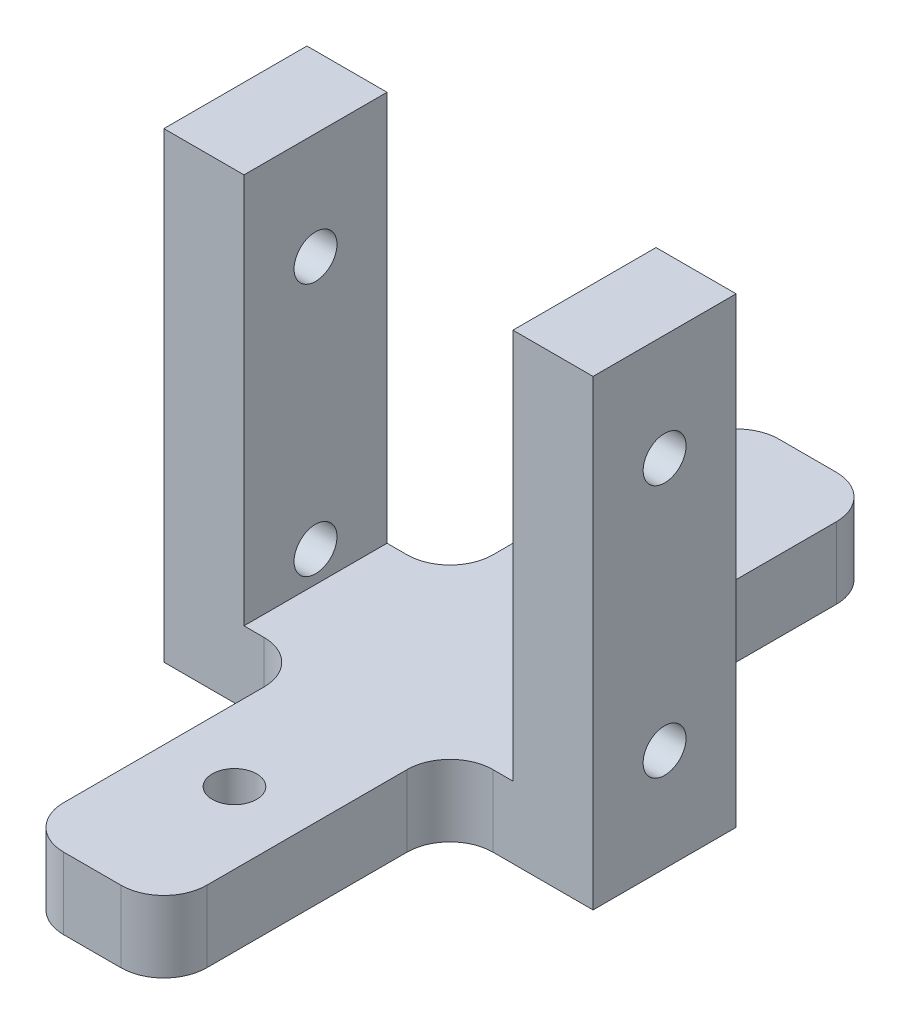
ISO-10303-21;
HEADER;
FILE_DESCRIPTION(('STEP AP214'),'2;1');
FILE_NAME('part.step','',(''),(''),'','','');
FILE_SCHEMA(('AUTOMOTIVE_DESIGN { 1 0 10303 214 1 1 1 1 }'));
ENDSEC;
DATA;
#1=APPLICATION_CONTEXT('core data for automotive mechanical design processes');
#2=APPLICATION_PROTOCOL_DEFINITION('international standard','automotive_design',2000,#1);
#3=PRODUCT_CONTEXT('',#1,'mechanical');
#4=PRODUCT('Part','Part','',(#3));
#5=PRODUCT_RELATED_PRODUCT_CATEGORY('part','',(#4));
#6=PRODUCT_DEFINITION_FORMATION('','',#4);
#7=PRODUCT_DEFINITION_CONTEXT('part definition',#1,'design');
#8=PRODUCT_DEFINITION('design','',#6,#7);
#9=PRODUCT_DEFINITION_SHAPE('','',#8);
#10=(LENGTH_UNIT() NAMED_UNIT(*) SI_UNIT(.MILLI.,.METRE.));
#11=(NAMED_UNIT(*) PLANE_ANGLE_UNIT() SI_UNIT($,.RADIAN.));
#12=(NAMED_UNIT(*) SI_UNIT($,.STERADIAN.) SOLID_ANGLE_UNIT());
#13=UNCERTAINTY_MEASURE_WITH_UNIT(LENGTH_MEASURE(1.E-05),#10,'distance_accuracy_value','');
#14=(GEOMETRIC_REPRESENTATION_CONTEXT(3) GLOBAL_UNCERTAINTY_ASSIGNED_CONTEXT((#13)) GLOBAL_UNIT_ASSIGNED_CONTEXT((#10,
#11,#12)) REPRESENTATION_CONTEXT('',''));
#15=CARTESIAN_POINT('',(0.,0.,0.));
#16=DIRECTION('',(0.,0.,1.));
#17=DIRECTION('',(1.,0.,0.));
#18=AXIS2_PLACEMENT_3D('',#15,#16,#17);
#19=CARTESIAN_POINT('',(-31.4324632794616,5.,-14.8201463090871));
#20=DIRECTION('',(0.,0.,-1.));
#21=DIRECTION('',(-1.,0.,0.));
#22=AXIS2_PLACEMENT_3D('',#19,#20,#21);
#23=PLANE('',#22);
#24=DIRECTION('',(1.,0.,0.));
#25=VECTOR('',#24,1.);
#26=CARTESIAN_POINT('',(-31.4324632794616,5.,-14.8201463090871));
#27=LINE('',#26,#25);
#28=CARTESIAN_POINT('',(-8.43246327946162,5.,-14.8201463090871));
#29=VERTEX_POINT('',#28);
#30=CARTESIAN_POINT('',(-7.03246327946162,5.,-14.8201463090871));
#31=VERTEX_POINT('',#30);
#32=EDGE_CURVE('E384',#29,#31,#27,.T.);
#33=ORIENTED_EDGE('',*,*,#32,.F.);
#34=DIRECTION('',(0.,1.,0.));
#35=VECTOR('',#34,1.);
#36=CARTESIAN_POINT('',(-8.43246327946162,0.,-14.8201463090871));
#37=LINE('',#36,#35);
#38=CARTESIAN_POINT('',(-8.43246327946162,0.,-14.8201463090871));
#39=VERTEX_POINT('',#38);
#40=EDGE_CURVE('E340',#29,#39,#37,.F.);
#41=ORIENTED_EDGE('',*,*,#40,.T.);
#42=DIRECTION('',(1.,0.,0.));
#43=VECTOR('',#42,1.);
#44=CARTESIAN_POINT('',(-31.4324632794616,0.,-14.8201463090871));
#45=LINE('',#44,#43);
#46=CARTESIAN_POINT('',(-1.43246327946162,0.,-14.8201463090871));
#47=VERTEX_POINT('',#46);
#48=EDGE_CURVE('E316',#39,#47,#45,.T.);
#49=ORIENTED_EDGE('',*,*,#48,.T.);
#50=DIRECTION('',(0.,-1.,0.));
#51=VECTOR('',#50,1.);
#52=CARTESIAN_POINT('',(-1.43246327946162,5.,-14.8201463090871));
#53=LINE('',#52,#51);
#54=CARTESIAN_POINT('',(-1.43246327946162,32.3,-14.8201463090871));
#55=VERTEX_POINT('',#54);
#56=EDGE_CURVE('E203',#55,#47,#53,.T.);
#57=ORIENTED_EDGE('',*,*,#56,.F.);
#58=DIRECTION('',(1.,0.,0.));
#59=VECTOR('',#58,1.);
#60=CARTESIAN_POINT('',(-1.43246327946162,32.3,-14.8201463090871));
#61=LINE('',#60,#59);
#62=CARTESIAN_POINT('',(-7.03246327946162,32.3,-14.8201463090871));
#63=VERTEX_POINT('',#62);
#64=EDGE_CURVE('E219',#63,#55,#61,.T.);
#65=ORIENTED_EDGE('',*,*,#64,.F.);
#66=DIRECTION('',(0.,-1.,0.));
#67=VECTOR('',#66,1.);
#68=CARTESIAN_POINT('',(-7.03246327946162,32.3,-14.8201463090871));
#69=LINE('',#68,#67);
#70=EDGE_CURVE('E229',#63,#31,#69,.T.);
#71=ORIENTED_EDGE('',*,*,#70,.T.);
#72=EDGE_LOOP('',(#33,#41,#49,#57,#65,#71));
#73=FACE_BOUND('',#72,.T.);
#74=ADVANCED_FACE('F33',(#73),#23,.F.);
#75=CARTESIAN_POINT('',(-31.4324632794616,0.,-14.8201463090871));
#76=VERTEX_POINT('',#75);
#77=CARTESIAN_POINT('',(-24.4324632794616,0.,-14.8201463090871));
#78=VERTEX_POINT('',#77);
#79=EDGE_CURVE('E402',#76,#78,#45,.T.);
#80=ORIENTED_EDGE('',*,*,#79,.T.);
#81=DIRECTION('',(0.,-1.,0.));
#82=VECTOR('',#81,1.);
#83=CARTESIAN_POINT('',(-24.4324632794616,5.,-14.8201463090871));
#84=LINE('',#83,#82);
#85=CARTESIAN_POINT('',(-24.4324632794616,5.,-14.8201463090871));
#86=VERTEX_POINT('',#85);
#87=EDGE_CURVE('E346',#78,#86,#84,.F.);
#88=ORIENTED_EDGE('',*,*,#87,.T.);
#89=CARTESIAN_POINT('',(-25.8324632794616,5.,-14.8201463090871));
#90=VERTEX_POINT('',#89);
#91=EDGE_CURVE('E254',#90,#86,#27,.T.);
#92=ORIENTED_EDGE('',*,*,#91,.F.);
#93=DIRECTION('',(0.,-1.,0.));
#94=VECTOR('',#93,1.);
#95=CARTESIAN_POINT('',(-25.8324632794616,32.3,-14.8201463090871));
#96=LINE('',#95,#94);
#97=CARTESIAN_POINT('',(-25.8324632794616,32.3,-14.8201463090871));
#98=VERTEX_POINT('',#97);
#99=EDGE_CURVE('E258',#98,#90,#96,.T.);
#100=ORIENTED_EDGE('',*,*,#99,.F.);
#101=DIRECTION('',(1.,0.,0.));
#102=VECTOR('',#101,1.);
#103=CARTESIAN_POINT('',(-31.4324632794616,32.3,-14.8201463090871));
#104=LINE('',#103,#102);
#105=CARTESIAN_POINT('',(-31.4324632794616,32.3,-14.8201463090871));
#106=VERTEX_POINT('',#105);
#107=EDGE_CURVE('E238',#106,#98,#104,.T.);
#108=ORIENTED_EDGE('',*,*,#107,.F.);
#109=DIRECTION('',(0.,-1.,0.));
#110=VECTOR('',#109,1.);
#111=CARTESIAN_POINT('',(-31.4324632794616,5.,-14.8201463090871));
#112=LINE('',#111,#110);
#113=EDGE_CURVE('E422',#106,#76,#112,.T.);
#114=ORIENTED_EDGE('',*,*,#113,.T.);
#115=EDGE_LOOP('',(#80,#88,#92,#100,#108,#114));
#116=FACE_BOUND('',#115,.T.);
#117=ADVANCED_FACE('F485',(#116),#23,.F.);
#118=CARTESIAN_POINT('',(-31.4324632794616,5.,-24.8201463090871));
#119=DIRECTION('',(0.,0.,1.));
#120=DIRECTION('',(1.,0.,0.));
#121=AXIS2_PLACEMENT_3D('',#118,#119,#120);
#122=PLANE('',#121);
#123=DIRECTION('',(-1.,0.,0.));
#124=VECTOR('',#123,1.);
#125=CARTESIAN_POINT('',(-31.4324632794616,0.,-24.8201463090871));
#126=LINE('',#125,#124);
#127=CARTESIAN_POINT('',(-1.43246327946162,0.,-24.8201463090871));
#128=VERTEX_POINT('',#127);
#129=CARTESIAN_POINT('',(-8.43246327946162,0.,-24.8201463090871));
#130=VERTEX_POINT('',#129);
#131=EDGE_CURVE('E387',#128,#130,#126,.T.);
#132=ORIENTED_EDGE('',*,*,#131,.T.);
#133=DIRECTION('',(0.,-1.,0.));
#134=VECTOR('',#133,1.);
#135=CARTESIAN_POINT('',(-8.43246327946162,5.,-24.8201463090871));
#136=LINE('',#135,#134);
#137=CARTESIAN_POINT('',(-8.43246327946162,5.,-24.8201463090871));
#138=VERTEX_POINT('',#137);
#139=EDGE_CURVE('E333',#130,#138,#136,.F.);
#140=ORIENTED_EDGE('',*,*,#139,.T.);
#141=DIRECTION('',(-1.,0.,0.));
#142=VECTOR('',#141,1.);
#143=CARTESIAN_POINT('',(-31.4324632794616,5.,-24.8201463090871));
#144=LINE('',#143,#142);
#145=CARTESIAN_POINT('',(-7.03246327946162,5.,-24.8201463090871));
#146=VERTEX_POINT('',#145);
#147=EDGE_CURVE('E266',#146,#138,#144,.T.);
#148=ORIENTED_EDGE('',*,*,#147,.F.);
#149=DIRECTION('',(0.,-1.,0.));
#150=VECTOR('',#149,1.);
#151=CARTESIAN_POINT('',(-7.03246327946162,32.3,-24.8201463090871));
#152=LINE('',#151,#150);
#153=CARTESIAN_POINT('',(-7.03246327946162,32.3,-24.8201463090871));
#154=VERTEX_POINT('',#153);
#155=EDGE_CURVE('E211',#154,#146,#152,.T.);
#156=ORIENTED_EDGE('',*,*,#155,.F.);
#157=DIRECTION('',(-1.,0.,0.));
#158=VECTOR('',#157,1.);
#159=CARTESIAN_POINT('',(-1.43246327946162,32.3,-24.8201463090871));
#160=LINE('',#159,#158);
#161=CARTESIAN_POINT('',(-1.43246327946162,32.3,-24.8201463090871));
#162=VERTEX_POINT('',#161);
#163=EDGE_CURVE('E207',#162,#154,#160,.T.);
#164=ORIENTED_EDGE('',*,*,#163,.F.);
#165=DIRECTION('',(0.,-1.,0.));
#166=VECTOR('',#165,1.);
#167=CARTESIAN_POINT('',(-1.43246327946162,5.,-24.8201463090871));
#168=LINE('',#167,#166);
#169=EDGE_CURVE('E192',#162,#128,#168,.T.);
#170=ORIENTED_EDGE('',*,*,#169,.T.);
#171=EDGE_LOOP('',(#132,#140,#148,#156,#164,#170));
#172=FACE_BOUND('',#171,.T.);
#173=ADVANCED_FACE('F208',(#172),#122,.F.);
#174=CARTESIAN_POINT('',(-24.4324632794616,5.,-24.8201463090871));
#175=VERTEX_POINT('',#174);
#176=CARTESIAN_POINT('',(-25.8324632794616,5.,-24.8201463090871));
#177=VERTEX_POINT('',#176);
#178=EDGE_CURVE('E269',#175,#177,#144,.T.);
#179=ORIENTED_EDGE('',*,*,#178,.F.);
#180=DIRECTION('',(0.,1.,0.));
#181=VECTOR('',#180,1.);
#182=CARTESIAN_POINT('',(-24.4324632794616,0.,-24.8201463090871));
#183=LINE('',#182,#181);
#184=CARTESIAN_POINT('',(-24.4324632794616,0.,-24.8201463090871));
#185=VERTEX_POINT('',#184);
#186=EDGE_CURVE('E282',#175,#185,#183,.F.);
#187=ORIENTED_EDGE('',*,*,#186,.T.);
#188=CARTESIAN_POINT('',(-31.4324632794616,0.,-24.8201463090871));
#189=VERTEX_POINT('',#188);
#190=EDGE_CURVE('E279',#185,#189,#126,.T.);
#191=ORIENTED_EDGE('',*,*,#190,.T.);
#192=DIRECTION('',(0.,-1.,0.));
#193=VECTOR('',#192,1.);
#194=CARTESIAN_POINT('',(-31.4324632794616,5.,-24.8201463090871));
#195=LINE('',#194,#193);
#196=CARTESIAN_POINT('',(-31.4324632794616,32.3,-24.8201463090871));
#197=VERTEX_POINT('',#196);
#198=EDGE_CURVE('E204',#197,#189,#195,.T.);
#199=ORIENTED_EDGE('',*,*,#198,.F.);
#200=DIRECTION('',(-1.,0.,0.));
#201=VECTOR('',#200,1.);
#202=CARTESIAN_POINT('',(-31.4324632794616,32.3,-24.8201463090871));
#203=LINE('',#202,#201);
#204=CARTESIAN_POINT('',(-25.8324632794616,32.3,-24.8201463090871));
#205=VERTEX_POINT('',#204);
#206=EDGE_CURVE('E242',#205,#197,#203,.T.);
#207=ORIENTED_EDGE('',*,*,#206,.F.);
#208=DIRECTION('',(0.,-1.,0.));
#209=VECTOR('',#208,1.);
#210=CARTESIAN_POINT('',(-25.8324632794616,32.3,-24.8201463090871));
#211=LINE('',#210,#209);
#212=EDGE_CURVE('E245',#205,#177,#211,.T.);
#213=ORIENTED_EDGE('',*,*,#212,.T.);
#214=EDGE_LOOP('',(#179,#187,#191,#199,#207,#213));
#215=FACE_BOUND('',#214,.T.);
#216=ADVANCED_FACE('F564',(#215),#122,.F.);
#217=CARTESIAN_POINT('',(0.,5.,0.));
#218=DIRECTION('',(0.,1.,0.));
#219=DIRECTION('',(0.,0.,1.));
#220=AXIS2_PLACEMENT_3D('',#217,#218,#219);
#221=PLANE('',#220);
#222=CARTESIAN_POINT('',(-16.4324632794616,5.,-4.75456092097002));
#223=DIRECTION('',(0.,1.,0.));
#224=DIRECTION('',(0.,0.,1.));
#225=AXIS2_PLACEMENT_3D('',#222,#223,#224);
#226=CIRCLE('',#225,1.55);
#227=CARTESIAN_POINT('',(-16.4324632794616,5.,-3.20456092097002));
#228=VERTEX_POINT('',#227);
#229=EDGE_CURVE('E859',#228,#228,#226,.T.);
#230=ORIENTED_EDGE('',*,*,#229,.F.);
#231=EDGE_LOOP('',(#230));
#232=FACE_BOUND('',#231,.T.);
#233=CARTESIAN_POINT('',(-16.4324632794616,5.,-34.8857316972041));
#234=DIRECTION('',(0.,1.,0.));
#235=DIRECTION('',(0.,0.,1.));
#236=AXIS2_PLACEMENT_3D('',#233,#234,#235);
#237=CIRCLE('',#236,1.55);
#238=CARTESIAN_POINT('',(-16.4324632794616,5.,-33.3357316972041));
#239=VERTEX_POINT('',#238);
#240=EDGE_CURVE('E854',#239,#239,#237,.T.);
#241=ORIENTED_EDGE('',*,*,#240,.F.);
#242=EDGE_LOOP('',(#241));
#243=FACE_BOUND('',#242,.T.);
#244=DIRECTION('',(1.,0.,0.));
#245=VECTOR('',#244,1.);
#246=CARTESIAN_POINT('',(-11.4324632794616,5.,-44.8201463090871));
#247=LINE('',#246,#245);
#248=CARTESIAN_POINT('',(-18.4324632794616,5.,-44.8201463090871));
#249=VERTEX_POINT('',#248);
#250=CARTESIAN_POINT('',(-14.4324632794616,5.,-44.8201463090871));
#251=VERTEX_POINT('',#250);
#252=EDGE_CURVE('E396',#249,#251,#247,.T.);
#253=ORIENTED_EDGE('',*,*,#252,.F.);
#254=CARTESIAN_POINT('',(-18.4324632794616,5.,-41.8201463090871));
#255=DIRECTION('',(0.,1.,0.));
#256=DIRECTION('',(0.,0.,1.));
#257=AXIS2_PLACEMENT_3D('',#254,#255,#256);
#258=CIRCLE('',#257,3.);
#259=CARTESIAN_POINT('',(-21.4324632794616,5.,-41.8201463090871));
#260=VERTEX_POINT('',#259);
#261=EDGE_CURVE('E322',#249,#260,#258,.T.);
#262=ORIENTED_EDGE('',*,*,#261,.T.);
#263=DIRECTION('',(0.,0.,1.));
#264=VECTOR('',#263,1.);
#265=CARTESIAN_POINT('',(-21.4324632794616,5.,-44.8201463090871));
#266=LINE('',#265,#264);
#267=CARTESIAN_POINT('',(-21.4324632794616,5.,-27.8201463090871));
#268=VERTEX_POINT('',#267);
#269=EDGE_CURVE('E395',#260,#268,#266,.T.);
#270=ORIENTED_EDGE('',*,*,#269,.T.);
#271=CARTESIAN_POINT('',(-24.4324632794616,5.,-27.8201463090871));
#272=DIRECTION('',(0.,1.,0.));
#273=DIRECTION('',(0.,0.,1.));
#274=AXIS2_PLACEMENT_3D('',#271,#272,#273);
#275=CIRCLE('',#274,3.);
#276=EDGE_CURVE('E354',#268,#175,#275,.F.);
#277=ORIENTED_EDGE('',*,*,#276,.T.);
#278=ORIENTED_EDGE('',*,*,#178,.T.);
#279=DIRECTION('',(0.,0.,-1.));
#280=VECTOR('',#279,1.);
#281=CARTESIAN_POINT('',(-25.8324632794616,5.,-14.8201463090871));
#282=LINE('',#281,#280);
#283=EDGE_CURVE('E234',#90,#177,#282,.T.);
#284=ORIENTED_EDGE('',*,*,#283,.F.);
#285=ORIENTED_EDGE('',*,*,#91,.T.);
#286=CARTESIAN_POINT('',(-24.4324632794616,5.,-11.8201463090871));
#287=DIRECTION('',(0.,1.,0.));
#288=DIRECTION('',(0.,0.,1.));
#289=AXIS2_PLACEMENT_3D('',#286,#287,#288);
#290=CIRCLE('',#289,3.);
#291=CARTESIAN_POINT('',(-21.4324632794616,5.,-11.8201463090871));
#292=VERTEX_POINT('',#291);
#293=EDGE_CURVE('E11',#86,#292,#290,.F.);
#294=ORIENTED_EDGE('',*,*,#293,.T.);
#295=DIRECTION('',(0.,0.,-1.));
#296=VECTOR('',#295,1.);
#297=CARTESIAN_POINT('',(-21.4324632794616,5.,5.17985369091294));
#298=LINE('',#297,#296);
#299=CARTESIAN_POINT('',(-21.4324632794616,5.,2.17985369091294));
#300=VERTEX_POINT('',#299);
#301=EDGE_CURVE('E292',#300,#292,#298,.T.);
#302=ORIENTED_EDGE('',*,*,#301,.F.);
#303=CARTESIAN_POINT('',(-18.4324632794616,5.,2.17985369091294));
#304=DIRECTION('',(0.,1.,0.));
#305=DIRECTION('',(0.,0.,1.));
#306=AXIS2_PLACEMENT_3D('',#303,#304,#305);
#307=CIRCLE('',#306,3.);
#308=CARTESIAN_POINT('',(-18.4324632794616,5.,5.17985369091294));
#309=VERTEX_POINT('',#308);
#310=EDGE_CURVE('E291',#300,#309,#307,.T.);
#311=ORIENTED_EDGE('',*,*,#310,.T.);
#312=DIRECTION('',(-1.,0.,0.));
#313=VECTOR('',#312,1.);
#314=CARTESIAN_POINT('',(-11.4324632794616,5.,5.17985369091294));
#315=LINE('',#314,#313);
#316=CARTESIAN_POINT('',(-14.4324632794616,5.,5.17985369091294));
#317=VERTEX_POINT('',#316);
#318=EDGE_CURVE('E532',#317,#309,#315,.T.);
#319=ORIENTED_EDGE('',*,*,#318,.F.);
#320=CARTESIAN_POINT('',(-14.4324632794616,5.,2.17985369091294));
#321=DIRECTION('',(0.,1.,0.));
#322=DIRECTION('',(0.,0.,1.));
#323=AXIS2_PLACEMENT_3D('',#320,#321,#322);
#324=CIRCLE('',#323,3.);
#325=CARTESIAN_POINT('',(-11.4324632794616,5.,2.17985369091294));
#326=VERTEX_POINT('',#325);
#327=EDGE_CURVE('E437',#317,#326,#324,.T.);
#328=ORIENTED_EDGE('',*,*,#327,.T.);
#329=DIRECTION('',(0.,0.,-1.));
#330=VECTOR('',#329,1.);
#331=CARTESIAN_POINT('',(-11.4324632794616,5.,5.17985369091294));
#332=LINE('',#331,#330);
#333=CARTESIAN_POINT('',(-11.4324632794616,5.,-11.8201463090871));
#334=VERTEX_POINT('',#333);
#335=EDGE_CURVE('E296',#326,#334,#332,.T.);
#336=ORIENTED_EDGE('',*,*,#335,.T.);
#337=CARTESIAN_POINT('',(-8.43246327946162,5.,-11.8201463090871));
#338=DIRECTION('',(0.,1.,0.));
#339=DIRECTION('',(0.,0.,1.));
#340=AXIS2_PLACEMENT_3D('',#337,#338,#339);
#341=CIRCLE('',#340,3.);
#342=EDGE_CURVE('E362',#334,#29,#341,.F.);
#343=ORIENTED_EDGE('',*,*,#342,.T.);
#344=ORIENTED_EDGE('',*,*,#32,.T.);
#345=DIRECTION('',(0.,0.,1.));
#346=VECTOR('',#345,1.);
#347=CARTESIAN_POINT('',(-7.03246327946162,5.,-24.8201463090871));
#348=LINE('',#347,#346);
#349=EDGE_CURVE('E220',#146,#31,#348,.T.);
#350=ORIENTED_EDGE('',*,*,#349,.F.);
#351=ORIENTED_EDGE('',*,*,#147,.T.);
#352=CARTESIAN_POINT('',(-8.43246327946162,5.,-27.8201463090871));
#353=DIRECTION('',(0.,1.,0.));
#354=DIRECTION('',(0.,0.,1.));
#355=AXIS2_PLACEMENT_3D('',#352,#353,#354);
#356=CIRCLE('',#355,3.);
#357=CARTESIAN_POINT('',(-11.4324632794616,5.,-27.8201463090871));
#358=VERTEX_POINT('',#357);
#359=EDGE_CURVE('E360',#138,#358,#356,.F.);
#360=ORIENTED_EDGE('',*,*,#359,.T.);
#361=DIRECTION('',(0.,0.,1.));
#362=VECTOR('',#361,1.);
#363=CARTESIAN_POINT('',(-11.4324632794616,5.,-44.8201463090871));
#364=LINE('',#363,#362);
#365=CARTESIAN_POINT('',(-11.4324632794616,5.,-41.8201463090871));
#366=VERTEX_POINT('',#365);
#367=EDGE_CURVE('E391',#366,#358,#364,.T.);
#368=ORIENTED_EDGE('',*,*,#367,.F.);
#369=CARTESIAN_POINT('',(-14.4324632794616,5.,-41.8201463090871));
#370=DIRECTION('',(0.,1.,0.));
#371=DIRECTION('',(0.,0.,1.));
#372=AXIS2_PLACEMENT_3D('',#369,#370,#371);
#373=CIRCLE('',#372,3.);
#374=EDGE_CURVE('E435',#366,#251,#373,.T.);
#375=ORIENTED_EDGE('',*,*,#374,.T.);
#376=EDGE_LOOP('',(#253,#262,#270,#277,#278,#284,#285,#294,#302,#311,#319,#328,#336,#343,#344,
#350,#351,#360,#368,#375));
#377=FACE_BOUND('',#376,.T.);
#378=ADVANCED_FACE('F383',(#232,#243,#377),#221,.T.);
#379=CARTESIAN_POINT('',(-31.4324632794616,5.,-24.8201463090871));
#380=DIRECTION('',(1.,0.,0.));
#381=DIRECTION('',(0.,0.,-1.));
#382=AXIS2_PLACEMENT_3D('',#379,#380,#381);
#383=PLANE('',#382);
#384=CARTESIAN_POINT('',(-31.4324632794616,24.85,-19.8201463090871));
#385=DIRECTION('',(1.,0.,0.));
#386=DIRECTION('',(0.,0.,-1.));
#387=AXIS2_PLACEMENT_3D('',#384,#385,#386);
#388=CIRCLE('',#387,1.5);
#389=CARTESIAN_POINT('',(-31.4324632794616,24.85,-21.3201463090871));
#390=VERTEX_POINT('',#389);
#391=EDGE_CURVE('E443',#390,#390,#388,.F.);
#392=ORIENTED_EDGE('',*,*,#391,.F.);
#393=EDGE_LOOP('',(#392));
#394=FACE_BOUND('',#393,.T.);
#395=CARTESIAN_POINT('',(-31.4324632794616,7.15,-19.8201463090871));
#396=DIRECTION('',(1.,0.,0.));
#397=DIRECTION('',(0.,0.,-1.));
#398=AXIS2_PLACEMENT_3D('',#395,#396,#397);
#399=CIRCLE('',#398,1.5);
#400=CARTESIAN_POINT('',(-31.4324632794616,7.15,-21.3201463090871));
#401=VERTEX_POINT('',#400);
#402=EDGE_CURVE('E457',#401,#401,#399,.F.);
#403=ORIENTED_EDGE('',*,*,#402,.F.);
#404=EDGE_LOOP('',(#403));
#405=FACE_BOUND('',#404,.T.);
#406=DIRECTION('',(0.,0.,1.));
#407=VECTOR('',#406,1.);
#408=CARTESIAN_POINT('',(-31.4324632794616,0.,-24.8201463090871));
#409=LINE('',#408,#407);
#410=EDGE_CURVE('E263',#189,#76,#409,.T.);
#411=ORIENTED_EDGE('',*,*,#410,.T.);
#412=ORIENTED_EDGE('',*,*,#113,.F.);
#413=DIRECTION('',(0.,0.,1.));
#414=VECTOR('',#413,1.);
#415=CARTESIAN_POINT('',(-31.4324632794616,32.3,-14.8201463090871));
#416=LINE('',#415,#414);
#417=EDGE_CURVE('E235',#197,#106,#416,.T.);
#418=ORIENTED_EDGE('',*,*,#417,.F.);
#419=ORIENTED_EDGE('',*,*,#198,.T.);
#420=EDGE_LOOP('',(#411,#412,#418,#419));
#421=FACE_BOUND('',#420,.T.);
#422=ADVANCED_FACE('F494',(#394,#405,#421),#383,.F.);
#423=CARTESIAN_POINT('',(-1.43246327946162,5.,-24.8201463090871));
#424=DIRECTION('',(-1.,0.,0.));
#425=DIRECTION('',(0.,0.,1.));
#426=AXIS2_PLACEMENT_3D('',#423,#424,#425);
#427=PLANE('',#426);
#428=CARTESIAN_POINT('',(-1.43246327946162,24.85,-19.8201463090871));
#429=DIRECTION('',(-1.,0.,0.));
#430=DIRECTION('',(0.,0.,1.));
#431=AXIS2_PLACEMENT_3D('',#428,#429,#430);
#432=CIRCLE('',#431,1.5);
#433=CARTESIAN_POINT('',(-1.43246327946162,24.85,-18.3201463090871));
#434=VERTEX_POINT('',#433);
#435=EDGE_CURVE('E440',#434,#434,#432,.T.);
#436=ORIENTED_EDGE('',*,*,#435,.T.);
#437=EDGE_LOOP('',(#436));
#438=FACE_BOUND('',#437,.T.);
#439=CARTESIAN_POINT('',(-1.43246327946162,7.15,-19.8201463090871));
#440=DIRECTION('',(-1.,0.,0.));
#441=DIRECTION('',(0.,0.,1.));
#442=AXIS2_PLACEMENT_3D('',#439,#440,#441);
#443=CIRCLE('',#442,1.5);
#444=CARTESIAN_POINT('',(-1.43246327946162,7.15,-18.3201463090871));
#445=VERTEX_POINT('',#444);
#446=EDGE_CURVE('E455',#445,#445,#443,.T.);
#447=ORIENTED_EDGE('',*,*,#446,.T.);
#448=EDGE_LOOP('',(#447));
#449=FACE_BOUND('',#448,.T.);
#450=DIRECTION('',(0.,0.,-1.));
#451=VECTOR('',#450,1.);
#452=CARTESIAN_POINT('',(-1.43246327946162,0.,-24.8201463090871));
#453=LINE('',#452,#451);
#454=EDGE_CURVE('E199',#47,#128,#453,.T.);
#455=ORIENTED_EDGE('',*,*,#454,.T.);
#456=ORIENTED_EDGE('',*,*,#169,.F.);
#457=DIRECTION('',(0.,0.,-1.));
#458=VECTOR('',#457,1.);
#459=CARTESIAN_POINT('',(-1.43246327946162,32.3,-24.8201463090871));
#460=LINE('',#459,#458);
#461=EDGE_CURVE('E197',#55,#162,#460,.T.);
#462=ORIENTED_EDGE('',*,*,#461,.F.);
#463=ORIENTED_EDGE('',*,*,#56,.T.);
#464=EDGE_LOOP('',(#455,#456,#462,#463));
#465=FACE_BOUND('',#464,.T.);
#466=ADVANCED_FACE('F194',(#438,#449,#465),#427,.F.);
#467=CARTESIAN_POINT('',(0.,0.,0.));
#468=DIRECTION('',(0.,1.,0.));
#469=DIRECTION('',(0.,0.,1.));
#470=AXIS2_PLACEMENT_3D('',#467,#468,#469);
#471=PLANE('',#470);
#472=CARTESIAN_POINT('',(-16.4324632794616,0.,-4.75456092097002));
#473=DIRECTION('',(0.,1.,0.));
#474=DIRECTION('',(0.,0.,1.));
#475=AXIS2_PLACEMENT_3D('',#472,#473,#474);
#476=CIRCLE('',#475,1.55);
#477=CARTESIAN_POINT('',(-16.4324632794616,0.,-3.20456092097002));
#478=VERTEX_POINT('',#477);
#479=EDGE_CURVE('E417',#478,#478,#476,.T.);
#480=ORIENTED_EDGE('',*,*,#479,.T.);
#481=EDGE_LOOP('',(#480));
#482=FACE_BOUND('',#481,.T.);
#483=CARTESIAN_POINT('',(-16.4324632794616,0.,-34.8857316972041));
#484=DIRECTION('',(0.,1.,0.));
#485=DIRECTION('',(0.,0.,1.));
#486=AXIS2_PLACEMENT_3D('',#483,#484,#485);
#487=CIRCLE('',#486,1.55);
#488=CARTESIAN_POINT('',(-16.4324632794616,0.,-33.3357316972041));
#489=VERTEX_POINT('',#488);
#490=EDGE_CURVE('E308',#489,#489,#487,.T.);
#491=ORIENTED_EDGE('',*,*,#490,.T.);
#492=EDGE_LOOP('',(#491));
#493=FACE_BOUND('',#492,.T.);
#494=DIRECTION('',(0.,0.,1.));
#495=VECTOR('',#494,1.);
#496=CARTESIAN_POINT('',(-21.4324632794616,0.,-44.8201463090871));
#497=LINE('',#496,#495);
#498=CARTESIAN_POINT('',(-21.4324632794616,0.,-41.8201463090871));
#499=VERTEX_POINT('',#498);
#500=CARTESIAN_POINT('',(-21.4324632794616,0.,-27.8201463090871));
#501=VERTEX_POINT('',#500);
#502=EDGE_CURVE('E416',#499,#501,#497,.T.);
#503=ORIENTED_EDGE('',*,*,#502,.F.);
#504=CARTESIAN_POINT('',(-18.4324632794616,0.,-41.8201463090871));
#505=DIRECTION('',(0.,1.,0.));
#506=DIRECTION('',(0.,0.,1.));
#507=AXIS2_PLACEMENT_3D('',#504,#505,#506);
#508=CIRCLE('',#507,3.);
#509=CARTESIAN_POINT('',(-18.4324632794616,0.,-44.8201463090871));
#510=VERTEX_POINT('',#509);
#511=EDGE_CURVE('E326',#499,#510,#508,.F.);
#512=ORIENTED_EDGE('',*,*,#511,.T.);
#513=DIRECTION('',(-1.,0.,0.));
#514=VECTOR('',#513,1.);
#515=CARTESIAN_POINT('',(-11.4324632794616,0.,-44.8201463090871));
#516=LINE('',#515,#514);
#517=CARTESIAN_POINT('',(-14.4324632794616,0.,-44.8201463090871));
#518=VERTEX_POINT('',#517);
#519=EDGE_CURVE('E536',#518,#510,#516,.T.);
#520=ORIENTED_EDGE('',*,*,#519,.F.);
#521=CARTESIAN_POINT('',(-14.4324632794616,0.,-41.8201463090871));
#522=DIRECTION('',(0.,1.,0.));
#523=DIRECTION('',(0.,0.,1.));
#524=AXIS2_PLACEMENT_3D('',#521,#522,#523);
#525=CIRCLE('',#524,3.);
#526=CARTESIAN_POINT('',(-11.4324632794616,0.,-41.8201463090871));
#527=VERTEX_POINT('',#526);
#528=EDGE_CURVE('E324',#518,#527,#525,.F.);
#529=ORIENTED_EDGE('',*,*,#528,.T.);
#530=DIRECTION('',(0.,0.,1.));
#531=VECTOR('',#530,1.);
#532=CARTESIAN_POINT('',(-11.4324632794616,0.,-44.8201463090871));
#533=LINE('',#532,#531);
#534=CARTESIAN_POINT('',(-11.4324632794616,0.,-27.8201463090871));
#535=VERTEX_POINT('',#534);
#536=EDGE_CURVE('E420',#527,#535,#533,.T.);
#537=ORIENTED_EDGE('',*,*,#536,.T.);
#538=CARTESIAN_POINT('',(-8.43246327946162,0.,-27.8201463090871));
#539=DIRECTION('',(0.,1.,0.));
#540=DIRECTION('',(0.,0.,1.));
#541=AXIS2_PLACEMENT_3D('',#538,#539,#540);
#542=CIRCLE('',#541,3.);
#543=EDGE_CURVE('E358',#535,#130,#542,.T.);
#544=ORIENTED_EDGE('',*,*,#543,.T.);
#545=ORIENTED_EDGE('',*,*,#131,.F.);
#546=ORIENTED_EDGE('',*,*,#454,.F.);
#547=ORIENTED_EDGE('',*,*,#48,.F.);
#548=CARTESIAN_POINT('',(-8.43246327946162,0.,-11.8201463090871));
#549=DIRECTION('',(0.,1.,0.));
#550=DIRECTION('',(0.,0.,1.));
#551=AXIS2_PLACEMENT_3D('',#548,#549,#550);
#552=CIRCLE('',#551,3.);
#553=CARTESIAN_POINT('',(-11.4324632794616,0.,-11.8201463090871));
#554=VERTEX_POINT('',#553);
#555=EDGE_CURVE('E364',#39,#554,#552,.T.);
#556=ORIENTED_EDGE('',*,*,#555,.T.);
#557=DIRECTION('',(0.,0.,-1.));
#558=VECTOR('',#557,1.);
#559=CARTESIAN_POINT('',(-11.4324632794616,0.,5.17985369091294));
#560=LINE('',#559,#558);
#561=CARTESIAN_POINT('',(-11.4324632794616,0.,2.17985369091294));
#562=VERTEX_POINT('',#561);
#563=EDGE_CURVE('E311',#562,#554,#560,.T.);
#564=ORIENTED_EDGE('',*,*,#563,.F.);
#565=CARTESIAN_POINT('',(-14.4324632794616,0.,2.17985369091294));
#566=DIRECTION('',(0.,1.,0.));
#567=DIRECTION('',(0.,0.,1.));
#568=AXIS2_PLACEMENT_3D('',#565,#566,#567);
#569=CIRCLE('',#568,3.);
#570=CARTESIAN_POINT('',(-14.4324632794616,0.,5.17985369091294));
#571=VERTEX_POINT('',#570);
#572=EDGE_CURVE('E321',#562,#571,#569,.F.);
#573=ORIENTED_EDGE('',*,*,#572,.T.);
#574=DIRECTION('',(1.,0.,0.));
#575=VECTOR('',#574,1.);
#576=CARTESIAN_POINT('',(-11.4324632794616,0.,5.17985369091294));
#577=LINE('',#576,#575);
#578=CARTESIAN_POINT('',(-18.4324632794616,0.,5.17985369091294));
#579=VERTEX_POINT('',#578);
#580=EDGE_CURVE('E315',#579,#571,#577,.T.);
#581=ORIENTED_EDGE('',*,*,#580,.F.);
#582=CARTESIAN_POINT('',(-18.4324632794616,0.,2.17985369091294));
#583=DIRECTION('',(0.,1.,0.));
#584=DIRECTION('',(0.,0.,1.));
#585=AXIS2_PLACEMENT_3D('',#582,#583,#584);
#586=CIRCLE('',#585,3.);
#587=CARTESIAN_POINT('',(-21.4324632794616,0.,2.17985369091294));
#588=VERTEX_POINT('',#587);
#589=EDGE_CURVE('E319',#579,#588,#586,.F.);
#590=ORIENTED_EDGE('',*,*,#589,.T.);
#591=DIRECTION('',(0.,0.,-1.));
#592=VECTOR('',#591,1.);
#593=CARTESIAN_POINT('',(-21.4324632794616,0.,5.17985369091294));
#594=LINE('',#593,#592);
#595=CARTESIAN_POINT('',(-21.4324632794616,0.,-11.8201463090871));
#596=VERTEX_POINT('',#595);
#597=EDGE_CURVE('E297',#588,#596,#594,.T.);
#598=ORIENTED_EDGE('',*,*,#597,.T.);
#599=CARTESIAN_POINT('',(-24.4324632794616,0.,-11.8201463090871));
#600=DIRECTION('',(0.,1.,0.));
#601=DIRECTION('',(0.,0.,1.));
#602=AXIS2_PLACEMENT_3D('',#599,#600,#601);
#603=CIRCLE('',#602,3.);
#604=EDGE_CURVE('E41',#596,#78,#603,.T.);
#605=ORIENTED_EDGE('',*,*,#604,.T.);
#606=ORIENTED_EDGE('',*,*,#79,.F.);
#607=ORIENTED_EDGE('',*,*,#410,.F.);
#608=ORIENTED_EDGE('',*,*,#190,.F.);
#609=CARTESIAN_POINT('',(-24.4324632794616,0.,-27.8201463090871));
#610=DIRECTION('',(0.,1.,0.));
#611=DIRECTION('',(0.,0.,1.));
#612=AXIS2_PLACEMENT_3D('',#609,#610,#611);
#613=CIRCLE('',#612,3.);
#614=EDGE_CURVE('E356',#185,#501,#613,.T.);
#615=ORIENTED_EDGE('',*,*,#614,.T.);
#616=EDGE_LOOP('',(#503,#512,#520,#529,#537,#544,#545,#546,#547,#556,#564,#573,#581,#590,#598,
#605,#606,#607,#608,#615));
#617=FACE_BOUND('',#616,.T.);
#618=ADVANCED_FACE('F369',(#482,#493,#617),#471,.F.);
#619=CARTESIAN_POINT('',(-25.8324632794616,32.3,-14.8201463090871));
#620=DIRECTION('',(-1.,0.,0.));
#621=DIRECTION('',(0.,0.,1.));
#622=AXIS2_PLACEMENT_3D('',#619,#620,#621);
#623=PLANE('',#622);
#624=CARTESIAN_POINT('',(-25.8324632794616,24.85,-19.8201463090871));
#625=DIRECTION('',(-1.,0.,0.));
#626=DIRECTION('',(0.,0.,1.));
#627=AXIS2_PLACEMENT_3D('',#624,#625,#626);
#628=CIRCLE('',#627,1.5);
#629=CARTESIAN_POINT('',(-25.8324632794616,24.85,-18.3201463090871));
#630=VERTEX_POINT('',#629);
#631=EDGE_CURVE('E452',#630,#630,#628,.T.);
#632=ORIENTED_EDGE('',*,*,#631,.T.);
#633=EDGE_LOOP('',(#632));
#634=FACE_BOUND('',#633,.T.);
#635=CARTESIAN_POINT('',(-25.8324632794616,7.15,-19.8201463090871));
#636=DIRECTION('',(-1.,0.,0.));
#637=DIRECTION('',(0.,0.,1.));
#638=AXIS2_PLACEMENT_3D('',#635,#636,#637);
#639=CIRCLE('',#638,1.5);
#640=CARTESIAN_POINT('',(-25.8324632794616,7.15,-18.3201463090871));
#641=VERTEX_POINT('',#640);
#642=EDGE_CURVE('E223',#641,#641,#639,.T.);
#643=ORIENTED_EDGE('',*,*,#642,.T.);
#644=EDGE_LOOP('',(#643));
#645=FACE_BOUND('',#644,.T.);
#646=ORIENTED_EDGE('',*,*,#283,.T.);
#647=ORIENTED_EDGE('',*,*,#212,.F.);
#648=DIRECTION('',(0.,0.,-1.));
#649=VECTOR('',#648,1.);
#650=CARTESIAN_POINT('',(-25.8324632794616,32.3,-14.8201463090871));
#651=LINE('',#650,#649);
#652=EDGE_CURVE('E240',#98,#205,#651,.T.);
#653=ORIENTED_EDGE('',*,*,#652,.F.);
#654=ORIENTED_EDGE('',*,*,#99,.T.);
#655=EDGE_LOOP('',(#646,#647,#653,#654));
#656=FACE_BOUND('',#655,.T.);
#657=ADVANCED_FACE('F467',(#634,#645,#656),#623,.F.);
#658=CARTESIAN_POINT('',(0.,32.3,0.));
#659=DIRECTION('',(0.,-1.,0.));
#660=DIRECTION('',(0.,0.,-1.));
#661=AXIS2_PLACEMENT_3D('',#658,#659,#660);
#662=PLANE('',#661);
#663=ORIENTED_EDGE('',*,*,#417,.T.);
#664=ORIENTED_EDGE('',*,*,#107,.T.);
#665=ORIENTED_EDGE('',*,*,#652,.T.);
#666=ORIENTED_EDGE('',*,*,#206,.T.);
#667=EDGE_LOOP('',(#663,#664,#665,#666));
#668=FACE_BOUND('',#667,.T.);
#669=ADVANCED_FACE('F601',(#668),#662,.F.);
#670=CARTESIAN_POINT('',(-7.03246327946162,32.3,-24.8201463090871));
#671=DIRECTION('',(1.,0.,0.));
#672=DIRECTION('',(0.,0.,-1.));
#673=AXIS2_PLACEMENT_3D('',#670,#671,#672);
#674=PLANE('',#673);
#675=CARTESIAN_POINT('',(-7.03246327946162,24.85,-19.8201463090871));
#676=DIRECTION('',(1.,0.,0.));
#677=DIRECTION('',(0.,0.,-1.));
#678=AXIS2_PLACEMENT_3D('',#675,#676,#677);
#679=CIRCLE('',#678,1.5);
#680=CARTESIAN_POINT('',(-7.03246327946162,24.85,-21.3201463090871));
#681=VERTEX_POINT('',#680);
#682=EDGE_CURVE('E410',#681,#681,#679,.T.);
#683=ORIENTED_EDGE('',*,*,#682,.T.);
#684=EDGE_LOOP('',(#683));
#685=FACE_BOUND('',#684,.T.);
#686=CARTESIAN_POINT('',(-7.03246327946162,7.15,-19.8201463090871));
#687=DIRECTION('',(1.,0.,0.));
#688=DIRECTION('',(0.,0.,-1.));
#689=AXIS2_PLACEMENT_3D('',#686,#687,#688);
#690=CIRCLE('',#689,1.5);
#691=CARTESIAN_POINT('',(-7.03246327946162,7.15,-21.3201463090871));
#692=VERTEX_POINT('',#691);
#693=EDGE_CURVE('E270',#692,#692,#690,.T.);
#694=ORIENTED_EDGE('',*,*,#693,.T.);
#695=EDGE_LOOP('',(#694));
#696=FACE_BOUND('',#695,.T.);
#697=ORIENTED_EDGE('',*,*,#349,.T.);
#698=ORIENTED_EDGE('',*,*,#70,.F.);
#699=DIRECTION('',(0.,0.,1.));
#700=VECTOR('',#699,1.);
#701=CARTESIAN_POINT('',(-7.03246327946162,32.3,-24.8201463090871));
#702=LINE('',#701,#700);
#703=EDGE_CURVE('E214',#154,#63,#702,.T.);
#704=ORIENTED_EDGE('',*,*,#703,.F.);
#705=ORIENTED_EDGE('',*,*,#155,.T.);
#706=EDGE_LOOP('',(#697,#698,#704,#705));
#707=FACE_BOUND('',#706,.T.);
#708=ADVANCED_FACE('F551',(#685,#696,#707),#674,.F.);
#709=CARTESIAN_POINT('',(0.,32.3,0.));
#710=DIRECTION('',(0.,-1.,0.));
#711=DIRECTION('',(0.,0.,-1.));
#712=AXIS2_PLACEMENT_3D('',#709,#710,#711);
#713=PLANE('',#712);
#714=ORIENTED_EDGE('',*,*,#461,.T.);
#715=ORIENTED_EDGE('',*,*,#163,.T.);
#716=ORIENTED_EDGE('',*,*,#703,.T.);
#717=ORIENTED_EDGE('',*,*,#64,.T.);
#718=EDGE_LOOP('',(#714,#715,#716,#717));
#719=FACE_BOUND('',#718,.T.);
#720=ADVANCED_FACE('F217',(#719),#713,.F.);
#721=CARTESIAN_POINT('',(-35.6751039665809,7.15,-19.8201463090871));
#722=DIRECTION('',(1.,0.,0.));
#723=DIRECTION('',(0.,0.,-1.));
#724=AXIS2_PLACEMENT_3D('',#721,#722,#723);
#725=CYLINDRICAL_SURFACE('',#724,1.5);
#726=ORIENTED_EDGE('',*,*,#446,.F.);
#727=EDGE_LOOP('',(#726));
#728=FACE_BOUND('',#727,.T.);
#729=ORIENTED_EDGE('',*,*,#693,.F.);
#730=EDGE_LOOP('',(#729));
#731=FACE_BOUND('',#730,.T.);
#732=ADVANCED_FACE('F473',(#728,#731),#725,.F.);
#733=ORIENTED_EDGE('',*,*,#402,.T.);
#734=EDGE_LOOP('',(#733));
#735=FACE_BOUND('',#734,.T.);
#736=ORIENTED_EDGE('',*,*,#642,.F.);
#737=EDGE_LOOP('',(#736));
#738=FACE_BOUND('',#737,.T.);
#739=ADVANCED_FACE('F470',(#735,#738),#725,.F.);
#740=CARTESIAN_POINT('',(-35.6751039665809,24.85,-19.8201463090871));
#741=DIRECTION('',(1.,0.,0.));
#742=DIRECTION('',(0.,0.,-1.));
#743=AXIS2_PLACEMENT_3D('',#740,#741,#742);
#744=CYLINDRICAL_SURFACE('',#743,1.5);
#745=ORIENTED_EDGE('',*,*,#435,.F.);
#746=EDGE_LOOP('',(#745));
#747=FACE_BOUND('',#746,.T.);
#748=ORIENTED_EDGE('',*,*,#682,.F.);
#749=EDGE_LOOP('',(#748));
#750=FACE_BOUND('',#749,.T.);
#751=ADVANCED_FACE('F472',(#747,#750),#744,.F.);
#752=ORIENTED_EDGE('',*,*,#391,.T.);
#753=EDGE_LOOP('',(#752));
#754=FACE_BOUND('',#753,.T.);
#755=ORIENTED_EDGE('',*,*,#631,.F.);
#756=EDGE_LOOP('',(#755));
#757=FACE_BOUND('',#756,.T.);
#758=ADVANCED_FACE('F479',(#754,#757),#744,.F.);
#759=CARTESIAN_POINT('',(-11.4324632794616,5.,-44.8201463090871));
#760=DIRECTION('',(-1.,0.,0.));
#761=DIRECTION('',(0.,0.,1.));
#762=AXIS2_PLACEMENT_3D('',#759,#760,#761);
#763=PLANE('',#762);
#764=ORIENTED_EDGE('',*,*,#536,.F.);
#765=DIRECTION('',(0.,-1.,0.));
#766=VECTOR('',#765,1.);
#767=CARTESIAN_POINT('',(-11.4324632794616,5.,-41.8201463090871));
#768=LINE('',#767,#766);
#769=EDGE_CURVE('E331',#527,#366,#768,.F.);
#770=ORIENTED_EDGE('',*,*,#769,.T.);
#771=ORIENTED_EDGE('',*,*,#367,.T.);
#772=DIRECTION('',(0.,-1.,0.));
#773=VECTOR('',#772,1.);
#774=CARTESIAN_POINT('',(-11.4324632794616,0.,-27.8201463090871));
#775=LINE('',#774,#773);
#776=EDGE_CURVE('E328',#358,#535,#775,.T.);
#777=ORIENTED_EDGE('',*,*,#776,.T.);
#778=EDGE_LOOP('',(#764,#770,#771,#777));
#779=FACE_BOUND('',#778,.T.);
#780=ADVANCED_FACE('F545',(#779),#763,.F.);
#781=CARTESIAN_POINT('',(-21.4324632794616,5.,-44.8201463090871));
#782=DIRECTION('',(1.,0.,0.));
#783=DIRECTION('',(0.,0.,-1.));
#784=AXIS2_PLACEMENT_3D('',#781,#782,#783);
#785=PLANE('',#784);
#786=ORIENTED_EDGE('',*,*,#502,.T.);
#787=DIRECTION('',(0.,1.,0.));
#788=VECTOR('',#787,1.);
#789=CARTESIAN_POINT('',(-21.4324632794616,5.,-27.8201463090871));
#790=LINE('',#789,#788);
#791=EDGE_CURVE('E285',#501,#268,#790,.T.);
#792=ORIENTED_EDGE('',*,*,#791,.T.);
#793=ORIENTED_EDGE('',*,*,#269,.F.);
#794=DIRECTION('',(0.,1.,0.));
#795=VECTOR('',#794,1.);
#796=CARTESIAN_POINT('',(-21.4324632794616,0.,-41.8201463090871));
#797=LINE('',#796,#795);
#798=EDGE_CURVE('E421',#260,#499,#797,.F.);
#799=ORIENTED_EDGE('',*,*,#798,.T.);
#800=EDGE_LOOP('',(#786,#792,#793,#799));
#801=FACE_BOUND('',#800,.T.);
#802=ADVANCED_FACE('F427',(#801),#785,.F.);
#803=CARTESIAN_POINT('',(0.,0.,-44.8201463090871));
#804=DIRECTION('',(0.,0.,-1.));
#805=DIRECTION('',(-1.,0.,0.));
#806=AXIS2_PLACEMENT_3D('',#803,#804,#805);
#807=PLANE('',#806);
#808=ORIENTED_EDGE('',*,*,#519,.T.);
#809=DIRECTION('',(0.,1.,0.));
#810=VECTOR('',#809,1.);
#811=CARTESIAN_POINT('',(-18.4324632794616,5.,-44.8201463090871));
#812=LINE('',#811,#810);
#813=EDGE_CURVE('E288',#510,#249,#812,.T.);
#814=ORIENTED_EDGE('',*,*,#813,.T.);
#815=ORIENTED_EDGE('',*,*,#252,.T.);
#816=DIRECTION('',(0.,-1.,0.));
#817=VECTOR('',#816,1.);
#818=CARTESIAN_POINT('',(-14.4324632794616,0.,-44.8201463090871));
#819=LINE('',#818,#817);
#820=EDGE_CURVE('E284',#251,#518,#819,.T.);
#821=ORIENTED_EDGE('',*,*,#820,.T.);
#822=EDGE_LOOP('',(#808,#814,#815,#821));
#823=FACE_BOUND('',#822,.T.);
#824=ADVANCED_FACE('F541',(#823),#807,.T.);
#825=CARTESIAN_POINT('',(-11.4324632794616,5.,5.17985369091294));
#826=DIRECTION('',(-1.,0.,0.));
#827=DIRECTION('',(0.,0.,1.));
#828=AXIS2_PLACEMENT_3D('',#825,#826,#827);
#829=PLANE('',#828);
#830=ORIENTED_EDGE('',*,*,#563,.T.);
#831=DIRECTION('',(0.,1.,0.));
#832=VECTOR('',#831,1.);
#833=CARTESIAN_POINT('',(-11.4324632794616,5.,-11.8201463090871));
#834=LINE('',#833,#832);
#835=EDGE_CURVE('E337',#554,#334,#834,.T.);
#836=ORIENTED_EDGE('',*,*,#835,.T.);
#837=ORIENTED_EDGE('',*,*,#335,.F.);
#838=DIRECTION('',(0.,1.,0.));
#839=VECTOR('',#838,1.);
#840=CARTESIAN_POINT('',(-11.4324632794616,5.,2.17985369091294));
#841=LINE('',#840,#839);
#842=EDGE_CURVE('E335',#326,#562,#841,.F.);
#843=ORIENTED_EDGE('',*,*,#842,.T.);
#844=EDGE_LOOP('',(#830,#836,#837,#843));
#845=FACE_BOUND('',#844,.T.);
#846=ADVANCED_FACE('F375',(#845),#829,.F.);
#847=CARTESIAN_POINT('',(-21.4324632794616,5.,5.17985369091294));
#848=DIRECTION('',(1.,0.,0.));
#849=DIRECTION('',(0.,0.,-1.));
#850=AXIS2_PLACEMENT_3D('',#847,#848,#849);
#851=PLANE('',#850);
#852=ORIENTED_EDGE('',*,*,#301,.T.);
#853=DIRECTION('',(0.,-1.,0.));
#854=VECTOR('',#853,1.);
#855=CARTESIAN_POINT('',(-21.4324632794616,0.,-11.8201463090871));
#856=LINE('',#855,#854);
#857=EDGE_CURVE('E344',#292,#596,#856,.T.);
#858=ORIENTED_EDGE('',*,*,#857,.T.);
#859=ORIENTED_EDGE('',*,*,#597,.F.);
#860=DIRECTION('',(0.,-1.,0.));
#861=VECTOR('',#860,1.);
#862=CARTESIAN_POINT('',(-21.4324632794616,5.,2.17985369091294));
#863=LINE('',#862,#861);
#864=EDGE_CURVE('E342',#588,#300,#863,.F.);
#865=ORIENTED_EDGE('',*,*,#864,.T.);
#866=EDGE_LOOP('',(#852,#858,#859,#865));
#867=FACE_BOUND('',#866,.T.);
#868=ADVANCED_FACE('F573',(#867),#851,.F.);
#869=CARTESIAN_POINT('',(0.,0.,5.17985369091294));
#870=DIRECTION('',(0.,0.,-1.));
#871=DIRECTION('',(-1.,0.,0.));
#872=AXIS2_PLACEMENT_3D('',#869,#870,#871);
#873=PLANE('',#872);
#874=ORIENTED_EDGE('',*,*,#580,.T.);
#875=DIRECTION('',(0.,1.,0.));
#876=VECTOR('',#875,1.);
#877=CARTESIAN_POINT('',(-14.4324632794616,0.,5.17985369091294));
#878=LINE('',#877,#876);
#879=EDGE_CURVE('E351',#571,#317,#878,.T.);
#880=ORIENTED_EDGE('',*,*,#879,.T.);
#881=ORIENTED_EDGE('',*,*,#318,.T.);
#882=DIRECTION('',(0.,-1.,0.));
#883=VECTOR('',#882,1.);
#884=CARTESIAN_POINT('',(-18.4324632794616,0.,5.17985369091294));
#885=LINE('',#884,#883);
#886=EDGE_CURVE('E348',#309,#579,#885,.T.);
#887=ORIENTED_EDGE('',*,*,#886,.T.);
#888=EDGE_LOOP('',(#874,#880,#881,#887));
#889=FACE_BOUND('',#888,.T.);
#890=ADVANCED_FACE('F528',(#889),#873,.F.);
#891=CARTESIAN_POINT('',(-16.4324632794616,-4.99999999997031E-05,-34.8857316972041));
#892=DIRECTION('',(0.,1.,0.));
#893=DIRECTION('',(0.,0.,1.));
#894=AXIS2_PLACEMENT_3D('',#891,#892,#893);
#895=CYLINDRICAL_SURFACE('',#894,1.55);
#896=ORIENTED_EDGE('',*,*,#240,.T.);
#897=EDGE_LOOP('',(#896));
#898=FACE_BOUND('',#897,.T.);
#899=ORIENTED_EDGE('',*,*,#490,.F.);
#900=EDGE_LOOP('',(#899));
#901=FACE_BOUND('',#900,.T.);
#902=ADVANCED_FACE('F582',(#898,#901),#895,.F.);
#903=CARTESIAN_POINT('',(-16.4324632794616,-4.99999999997031E-05,-4.75456092097002));
#904=DIRECTION('',(0.,1.,0.));
#905=DIRECTION('',(0.,0.,1.));
#906=AXIS2_PLACEMENT_3D('',#903,#904,#905);
#907=CYLINDRICAL_SURFACE('',#906,1.55);
#908=ORIENTED_EDGE('',*,*,#229,.T.);
#909=EDGE_LOOP('',(#908));
#910=FACE_BOUND('',#909,.T.);
#911=ORIENTED_EDGE('',*,*,#479,.F.);
#912=EDGE_LOOP('',(#911));
#913=FACE_BOUND('',#912,.T.);
#914=ADVANCED_FACE('F502',(#910,#913),#907,.F.);
#915=CARTESIAN_POINT('',(-24.4324632794616,5.,-27.8201463090871));
#916=DIRECTION('',(0.,-1.,0.));
#917=DIRECTION('',(0.,0.,-1.));
#918=AXIS2_PLACEMENT_3D('',#915,#916,#917);
#919=CYLINDRICAL_SURFACE('',#918,3.);
#920=ORIENTED_EDGE('',*,*,#614,.F.);
#921=ORIENTED_EDGE('',*,*,#186,.F.);
#922=ORIENTED_EDGE('',*,*,#276,.F.);
#923=ORIENTED_EDGE('',*,*,#791,.F.);
#924=EDGE_LOOP('',(#920,#921,#922,#923));
#925=FACE_BOUND('',#924,.T.);
#926=ADVANCED_FACE('F498',(#925),#919,.F.);
#927=CARTESIAN_POINT('',(-18.4324632794616,0.,-41.8201463090871));
#928=DIRECTION('',(0.,-1.,0.));
#929=DIRECTION('',(0.,0.,-1.));
#930=AXIS2_PLACEMENT_3D('',#927,#928,#929);
#931=CYLINDRICAL_SURFACE('',#930,3.);
#932=ORIENTED_EDGE('',*,*,#511,.F.);
#933=ORIENTED_EDGE('',*,*,#798,.F.);
#934=ORIENTED_EDGE('',*,*,#261,.F.);
#935=ORIENTED_EDGE('',*,*,#813,.F.);
#936=EDGE_LOOP('',(#932,#933,#934,#935));
#937=FACE_BOUND('',#936,.T.);
#938=ADVANCED_FACE('F501',(#937),#931,.T.);
#939=CARTESIAN_POINT('',(-14.4324632794616,0.,-41.8201463090871));
#940=DIRECTION('',(0.,1.,0.));
#941=DIRECTION('',(0.,0.,1.));
#942=AXIS2_PLACEMENT_3D('',#939,#940,#941);
#943=CYLINDRICAL_SURFACE('',#942,3.);
#944=ORIENTED_EDGE('',*,*,#374,.F.);
#945=ORIENTED_EDGE('',*,*,#769,.F.);
#946=ORIENTED_EDGE('',*,*,#528,.F.);
#947=ORIENTED_EDGE('',*,*,#820,.F.);
#948=EDGE_LOOP('',(#944,#945,#946,#947));
#949=FACE_BOUND('',#948,.T.);
#950=ADVANCED_FACE('F505',(#949),#943,.T.);
#951=CARTESIAN_POINT('',(-8.43246327946162,5.,-27.8201463090871));
#952=DIRECTION('',(0.,1.,0.));
#953=DIRECTION('',(0.,0.,1.));
#954=AXIS2_PLACEMENT_3D('',#951,#952,#953);
#955=CYLINDRICAL_SURFACE('',#954,3.);
#956=ORIENTED_EDGE('',*,*,#359,.F.);
#957=ORIENTED_EDGE('',*,*,#139,.F.);
#958=ORIENTED_EDGE('',*,*,#543,.F.);
#959=ORIENTED_EDGE('',*,*,#776,.F.);
#960=EDGE_LOOP('',(#956,#957,#958,#959));
#961=FACE_BOUND('',#960,.T.);
#962=ADVANCED_FACE('F508',(#961),#955,.F.);
#963=CARTESIAN_POINT('',(-8.43246327946162,5.,-11.8201463090871));
#964=DIRECTION('',(0.,-1.,0.));
#965=DIRECTION('',(0.,0.,-1.));
#966=AXIS2_PLACEMENT_3D('',#963,#964,#965);
#967=CYLINDRICAL_SURFACE('',#966,3.);
#968=ORIENTED_EDGE('',*,*,#555,.F.);
#969=ORIENTED_EDGE('',*,*,#40,.F.);
#970=ORIENTED_EDGE('',*,*,#342,.F.);
#971=ORIENTED_EDGE('',*,*,#835,.F.);
#972=EDGE_LOOP('',(#968,#969,#970,#971));
#973=FACE_BOUND('',#972,.T.);
#974=ADVANCED_FACE('F379',(#973),#967,.F.);
#975=CARTESIAN_POINT('',(-24.4324632794616,5.,-11.8201463090871));
#976=DIRECTION('',(0.,1.,0.));
#977=DIRECTION('',(0.,0.,1.));
#978=AXIS2_PLACEMENT_3D('',#975,#976,#977);
#979=CYLINDRICAL_SURFACE('',#978,3.);
#980=ORIENTED_EDGE('',*,*,#293,.F.);
#981=ORIENTED_EDGE('',*,*,#87,.F.);
#982=ORIENTED_EDGE('',*,*,#604,.F.);
#983=ORIENTED_EDGE('',*,*,#857,.F.);
#984=EDGE_LOOP('',(#980,#981,#982,#983));
#985=FACE_BOUND('',#984,.T.);
#986=ADVANCED_FACE('F515',(#985),#979,.F.);
#987=CARTESIAN_POINT('',(-14.4324632794616,0.,2.17985369091294));
#988=DIRECTION('',(0.,1.,0.));
#989=DIRECTION('',(0.,0.,1.));
#990=AXIS2_PLACEMENT_3D('',#987,#988,#989);
#991=CYLINDRICAL_SURFACE('',#990,3.);
#992=ORIENTED_EDGE('',*,*,#572,.F.);
#993=ORIENTED_EDGE('',*,*,#842,.F.);
#994=ORIENTED_EDGE('',*,*,#327,.F.);
#995=ORIENTED_EDGE('',*,*,#879,.F.);
#996=EDGE_LOOP('',(#992,#993,#994,#995));
#997=FACE_BOUND('',#996,.T.);
#998=ADVANCED_FACE('F517',(#997),#991,.T.);
#999=CARTESIAN_POINT('',(-18.4324632794616,0.,2.17985369091294));
#1000=DIRECTION('',(0.,-1.,0.));
#1001=DIRECTION('',(0.,0.,-1.));
#1002=AXIS2_PLACEMENT_3D('',#999,#1000,#1001);
#1003=CYLINDRICAL_SURFACE('',#1002,3.);
#1004=ORIENTED_EDGE('',*,*,#310,.F.);
#1005=ORIENTED_EDGE('',*,*,#864,.F.);
#1006=ORIENTED_EDGE('',*,*,#589,.F.);
#1007=ORIENTED_EDGE('',*,*,#886,.F.);
#1008=EDGE_LOOP('',(#1004,#1005,#1006,#1007));
#1009=FACE_BOUND('',#1008,.T.);
#1010=ADVANCED_FACE('F35',(#1009),#1003,.T.);
#1011=CLOSED_SHELL('',(#74,#117,#173,#216,#378,#422,#466,#618,#657,#669,#708,#720,#732,#739,
#751,#758,#780,#802,#824,#846,#868,#890,#902,#914,#926,#938,#950,#962,#974,#986,#998,#1010));
#1012=MANIFOLD_SOLID_BREP('B2',#1011);
#1013=ADVANCED_BREP_SHAPE_REPRESENTATION('',(#18,#1012),#14);
#1014=SHAPE_DEFINITION_REPRESENTATION(#9,#1013);
ENDSEC;
END-ISO-10303-21;
